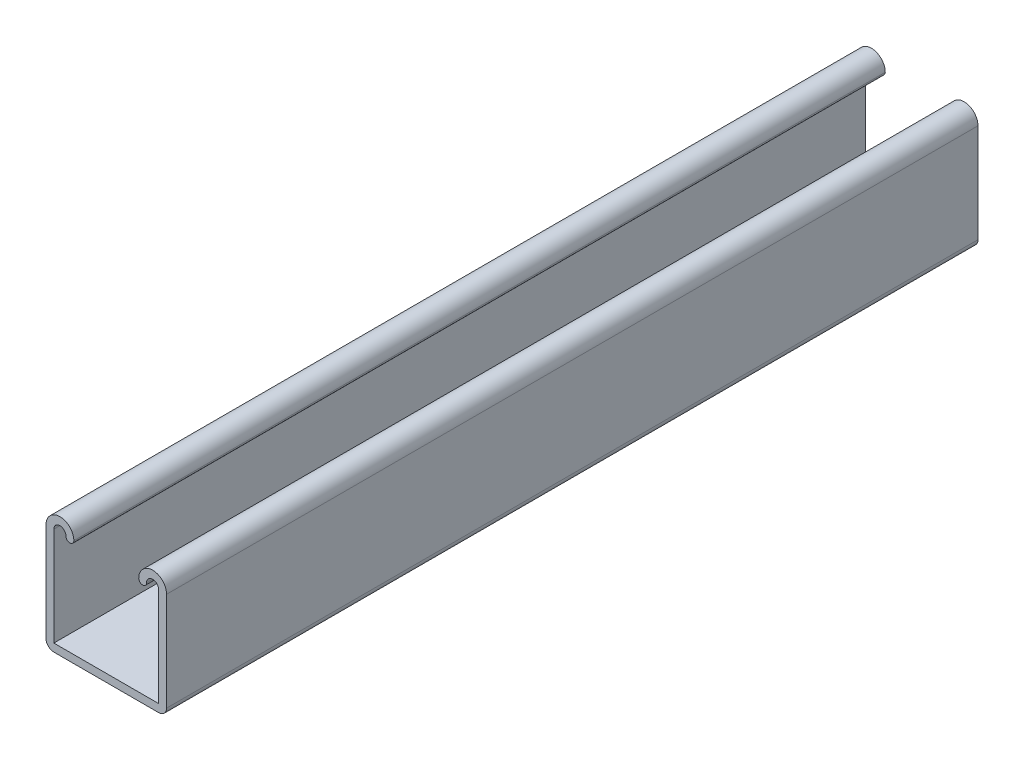
ISO-10303-21;
HEADER;
FILE_DESCRIPTION(('STEP AP214'),'2;1');
FILE_NAME('part.step','',(''),(''),'','','');
FILE_SCHEMA(('AUTOMOTIVE_DESIGN { 1 0 10303 214 1 1 1 1 }'));
ENDSEC;
DATA;
#1=APPLICATION_CONTEXT('core data for automotive mechanical design processes');
#2=APPLICATION_PROTOCOL_DEFINITION('international standard','automotive_design',2000,#1);
#3=PRODUCT_CONTEXT('',#1,'mechanical');
#4=PRODUCT('Part','Part','',(#3));
#5=PRODUCT_RELATED_PRODUCT_CATEGORY('part','',(#4));
#6=PRODUCT_DEFINITION_FORMATION('','',#4);
#7=PRODUCT_DEFINITION_CONTEXT('part definition',#1,'design');
#8=PRODUCT_DEFINITION('design','',#6,#7);
#9=PRODUCT_DEFINITION_SHAPE('','',#8);
#10=(LENGTH_UNIT() NAMED_UNIT(*) SI_UNIT(.MILLI.,.METRE.));
#11=(NAMED_UNIT(*) PLANE_ANGLE_UNIT() SI_UNIT($,.RADIAN.));
#12=(NAMED_UNIT(*) SI_UNIT($,.STERADIAN.) SOLID_ANGLE_UNIT());
#13=UNCERTAINTY_MEASURE_WITH_UNIT(LENGTH_MEASURE(1.E-05),#10,'distance_accuracy_value','');
#14=(GEOMETRIC_REPRESENTATION_CONTEXT(3) GLOBAL_UNCERTAINTY_ASSIGNED_CONTEXT((#13)) GLOBAL_UNIT_ASSIGNED_CONTEXT((#10,
#11,#12)) REPRESENTATION_CONTEXT('',''));
#15=CARTESIAN_POINT('',(0.,0.,0.));
#16=DIRECTION('',(0.,0.,1.));
#17=DIRECTION('',(1.,0.,0.));
#18=AXIS2_PLACEMENT_3D('',#15,#16,#17);
#19=CARTESIAN_POINT('',(0.,2.6924,278.384));
#20=DIRECTION('',(0.,0.,-1.));
#21=DIRECTION('',(-1.,0.,0.));
#22=AXIS2_PLACEMENT_3D('',#19,#20,#21);
#23=CYLINDRICAL_SURFACE('',#22,2.6924);
#24=CARTESIAN_POINT('',(0.,2.6924,0.));
#25=DIRECTION('',(0.,0.,1.));
#26=DIRECTION('',(-1.,0.,0.));
#27=AXIS2_PLACEMENT_3D('',#24,#25,#26);
#28=CIRCLE('',#27,2.6924);
#29=CARTESIAN_POINT('',(-2.6924,2.6924,0.));
#30=VERTEX_POINT('',#29);
#31=CARTESIAN_POINT('',(0.,0.,0.));
#32=VERTEX_POINT('',#31);
#33=EDGE_CURVE('E167',#30,#32,#28,.T.);
#34=ORIENTED_EDGE('',*,*,#33,.T.);
#35=DIRECTION('',(0.,0.,-1.));
#36=VECTOR('',#35,1.);
#37=CARTESIAN_POINT('',(0.,0.,278.384));
#38=LINE('',#37,#36);
#39=CARTESIAN_POINT('',(0.,0.,278.384));
#40=VERTEX_POINT('',#39);
#41=EDGE_CURVE('E225',#40,#32,#38,.T.);
#42=ORIENTED_EDGE('',*,*,#41,.F.);
#43=CARTESIAN_POINT('',(0.,2.6924,278.384));
#44=DIRECTION('',(0.,0.,1.));
#45=DIRECTION('',(-1.,0.,0.));
#46=AXIS2_PLACEMENT_3D('',#43,#44,#45);
#47=CIRCLE('',#46,2.6924);
#48=CARTESIAN_POINT('',(-2.6924,2.6924,278.384));
#49=VERTEX_POINT('',#48);
#50=EDGE_CURVE('E194',#49,#40,#47,.T.);
#51=ORIENTED_EDGE('',*,*,#50,.F.);
#52=DIRECTION('',(0.,0.,-1.));
#53=VECTOR('',#52,1.);
#54=CARTESIAN_POINT('',(-2.6924,2.6924,278.384));
#55=LINE('',#54,#53);
#56=EDGE_CURVE('E163',#49,#30,#55,.T.);
#57=ORIENTED_EDGE('',*,*,#56,.T.);
#58=EDGE_LOOP('',(#34,#42,#51,#57));
#59=FACE_BOUND('',#58,.T.);
#60=ADVANCED_FACE('F33',(#59),#23,.T.);
#61=CARTESIAN_POINT('',(0.,0.,278.384));
#62=DIRECTION('',(0.,1.,0.));
#63=DIRECTION('',(0.,0.,1.));
#64=AXIS2_PLACEMENT_3D('',#61,#62,#63);
#65=PLANE('',#64);
#66=CARTESIAN_POINT('',(17.99,0.,89.916));
#67=DIRECTION('',(0.,-1.,0.));
#68=DIRECTION('',(0.,0.,-1.));
#69=AXIS2_PLACEMENT_3D('',#66,#67,#68);
#70=CIRCLE('',#69,7.112);
#71=CARTESIAN_POINT('',(17.99,0.,82.804));
#72=VERTEX_POINT('',#71);
#73=EDGE_CURVE('E449',#72,#72,#70,.T.);
#74=ORIENTED_EDGE('',*,*,#73,.F.);
#75=EDGE_LOOP('',(#74));
#76=FACE_BOUND('',#75,.T.);
#77=CARTESIAN_POINT('',(17.99,0.,42.164));
#78=DIRECTION('',(0.,-1.,0.));
#79=DIRECTION('',(0.,0.,-1.));
#80=AXIS2_PLACEMENT_3D('',#77,#78,#79);
#81=CIRCLE('',#80,7.112);
#82=CARTESIAN_POINT('',(17.99,0.,35.052));
#83=VERTEX_POINT('',#82);
#84=EDGE_CURVE('E230',#83,#83,#81,.T.);
#85=ORIENTED_EDGE('',*,*,#84,.F.);
#86=EDGE_LOOP('',(#85));
#87=FACE_BOUND('',#86,.T.);
#88=DIRECTION('',(1.,0.,0.));
#89=VECTOR('',#88,1.);
#90=CARTESIAN_POINT('',(0.,0.,0.));
#91=LINE('',#90,#89);
#92=CARTESIAN_POINT('',(35.98,0.,0.));
#93=VERTEX_POINT('',#92);
#94=EDGE_CURVE('E170',#32,#93,#91,.T.);
#95=ORIENTED_EDGE('',*,*,#94,.T.);
#96=DIRECTION('',(0.,0.,-1.));
#97=VECTOR('',#96,1.);
#98=CARTESIAN_POINT('',(35.98,0.,278.384));
#99=LINE('',#98,#97);
#100=CARTESIAN_POINT('',(35.98,0.,278.384));
#101=VERTEX_POINT('',#100);
#102=EDGE_CURVE('E222',#101,#93,#99,.T.);
#103=ORIENTED_EDGE('',*,*,#102,.F.);
#104=DIRECTION('',(1.,0.,0.));
#105=VECTOR('',#104,1.);
#106=CARTESIAN_POINT('',(0.,0.,278.384));
#107=LINE('',#106,#105);
#108=EDGE_CURVE('E112',#40,#101,#107,.T.);
#109=ORIENTED_EDGE('',*,*,#108,.F.);
#110=ORIENTED_EDGE('',*,*,#41,.T.);
#111=EDGE_LOOP('',(#95,#103,#109,#110));
#112=FACE_BOUND('',#111,.T.);
#113=CARTESIAN_POINT('',(17.99,0.,137.668));
#114=DIRECTION('',(0.,-1.,0.));
#115=DIRECTION('',(0.,0.,-1.));
#116=AXIS2_PLACEMENT_3D('',#113,#114,#115);
#117=CIRCLE('',#116,7.112);
#118=CARTESIAN_POINT('',(17.99,0.,130.556));
#119=VERTEX_POINT('',#118);
#120=EDGE_CURVE('E227',#119,#119,#117,.T.);
#121=ORIENTED_EDGE('',*,*,#120,.F.);
#122=EDGE_LOOP('',(#121));
#123=FACE_BOUND('',#122,.T.);
#124=CARTESIAN_POINT('',(17.99,0.,185.42));
#125=DIRECTION('',(0.,-1.,0.));
#126=DIRECTION('',(0.,0.,-1.));
#127=AXIS2_PLACEMENT_3D('',#124,#125,#126);
#128=CIRCLE('',#127,7.112);
#129=CARTESIAN_POINT('',(17.99,0.,178.308));
#130=VERTEX_POINT('',#129);
#131=EDGE_CURVE('E236',#130,#130,#128,.T.);
#132=ORIENTED_EDGE('',*,*,#131,.F.);
#133=EDGE_LOOP('',(#132));
#134=FACE_BOUND('',#133,.T.);
#135=CARTESIAN_POINT('',(17.99,0.,233.172));
#136=DIRECTION('',(0.,-1.,0.));
#137=DIRECTION('',(0.,0.,-1.));
#138=AXIS2_PLACEMENT_3D('',#135,#136,#137);
#139=CIRCLE('',#138,7.112);
#140=CARTESIAN_POINT('',(17.99,0.,226.06));
#141=VERTEX_POINT('',#140);
#142=EDGE_CURVE('E42',#141,#141,#139,.T.);
#143=ORIENTED_EDGE('',*,*,#142,.F.);
#144=EDGE_LOOP('',(#143));
#145=FACE_BOUND('',#144,.T.);
#146=ADVANCED_FACE('F246',(#76,#87,#112,#123,#134,#145),#65,.F.);
#147=CARTESIAN_POINT('',(35.98,2.6924,278.384));
#148=DIRECTION('',(0.,0.,-1.));
#149=DIRECTION('',(-1.,0.,0.));
#150=AXIS2_PLACEMENT_3D('',#147,#148,#149);
#151=CYLINDRICAL_SURFACE('',#150,2.6924);
#152=CARTESIAN_POINT('',(35.98,2.6924,0.));
#153=DIRECTION('',(0.,0.,1.));
#154=DIRECTION('',(1.,0.,0.));
#155=AXIS2_PLACEMENT_3D('',#152,#153,#154);
#156=CIRCLE('',#155,2.6924);
#157=CARTESIAN_POINT('',(38.6724,2.6924,0.));
#158=VERTEX_POINT('',#157);
#159=EDGE_CURVE('E173',#93,#158,#156,.T.);
#160=ORIENTED_EDGE('',*,*,#159,.T.);
#161=DIRECTION('',(0.,0.,-1.));
#162=VECTOR('',#161,1.);
#163=CARTESIAN_POINT('',(38.6724,2.6924,278.384));
#164=LINE('',#163,#162);
#165=CARTESIAN_POINT('',(38.6724,2.6924,278.384));
#166=VERTEX_POINT('',#165);
#167=EDGE_CURVE('E219',#166,#158,#164,.T.);
#168=ORIENTED_EDGE('',*,*,#167,.F.);
#169=CARTESIAN_POINT('',(35.98,2.6924,278.384));
#170=DIRECTION('',(0.,0.,1.));
#171=DIRECTION('',(1.,0.,0.));
#172=AXIS2_PLACEMENT_3D('',#169,#170,#171);
#173=CIRCLE('',#172,2.6924);
#174=EDGE_CURVE('E459',#101,#166,#173,.T.);
#175=ORIENTED_EDGE('',*,*,#174,.F.);
#176=ORIENTED_EDGE('',*,*,#102,.T.);
#177=EDGE_LOOP('',(#160,#168,#175,#176));
#178=FACE_BOUND('',#177,.T.);
#179=ADVANCED_FACE('F248',(#178),#151,.T.);
#180=CARTESIAN_POINT('',(38.6724,2.6924,278.384));
#181=DIRECTION('',(-1.,0.,0.));
#182=DIRECTION('',(0.,0.,1.));
#183=AXIS2_PLACEMENT_3D('',#180,#181,#182);
#184=PLANE('',#183);
#185=DIRECTION('',(0.,1.,0.));
#186=VECTOR('',#185,1.);
#187=CARTESIAN_POINT('',(38.6724,2.6924,0.));
#188=LINE('',#187,#186);
#189=CARTESIAN_POINT('',(38.6724,36.5252,0.));
#190=VERTEX_POINT('',#189);
#191=EDGE_CURVE('E175',#158,#190,#188,.T.);
#192=ORIENTED_EDGE('',*,*,#191,.T.);
#193=DIRECTION('',(0.,0.,-1.));
#194=VECTOR('',#193,1.);
#195=CARTESIAN_POINT('',(38.6724,36.5252,278.384));
#196=LINE('',#195,#194);
#197=CARTESIAN_POINT('',(38.6724,36.5252,278.384));
#198=VERTEX_POINT('',#197);
#199=EDGE_CURVE('E216',#198,#190,#196,.T.);
#200=ORIENTED_EDGE('',*,*,#199,.F.);
#201=DIRECTION('',(0.,1.,0.));
#202=VECTOR('',#201,1.);
#203=CARTESIAN_POINT('',(38.6724,2.6924,278.384));
#204=LINE('',#203,#202);
#205=EDGE_CURVE('E461',#166,#198,#204,.T.);
#206=ORIENTED_EDGE('',*,*,#205,.F.);
#207=ORIENTED_EDGE('',*,*,#167,.T.);
#208=EDGE_LOOP('',(#192,#200,#206,#207));
#209=FACE_BOUND('',#208,.T.);
#210=ADVANCED_FACE('F255',(#209),#184,.F.);
#211=CARTESIAN_POINT('',(33.8972,36.5252,278.384));
#212=DIRECTION('',(0.,0.,-1.));
#213=DIRECTION('',(-1.,0.,0.));
#214=AXIS2_PLACEMENT_3D('',#211,#212,#213);
#215=CYLINDRICAL_SURFACE('',#214,4.7752);
#216=CARTESIAN_POINT('',(33.8972,36.5252,0.));
#217=DIRECTION('',(0.,0.,1.));
#218=DIRECTION('',(1.,0.,0.));
#219=AXIS2_PLACEMENT_3D('',#216,#217,#218);
#220=CIRCLE('',#219,4.7752);
#221=CARTESIAN_POINT('',(29.122,36.5252,0.));
#222=VERTEX_POINT('',#221);
#223=EDGE_CURVE('E177',#190,#222,#220,.T.);
#224=ORIENTED_EDGE('',*,*,#223,.T.);
#225=DIRECTION('',(0.,0.,-1.));
#226=VECTOR('',#225,1.);
#227=CARTESIAN_POINT('',(29.122,36.5252,278.384));
#228=LINE('',#227,#226);
#229=CARTESIAN_POINT('',(29.122,36.5252,278.384));
#230=VERTEX_POINT('',#229);
#231=EDGE_CURVE('E213',#230,#222,#228,.T.);
#232=ORIENTED_EDGE('',*,*,#231,.F.);
#233=CARTESIAN_POINT('',(33.8972,36.5252,278.384));
#234=DIRECTION('',(0.,0.,1.));
#235=DIRECTION('',(1.,0.,0.));
#236=AXIS2_PLACEMENT_3D('',#233,#234,#235);
#237=CIRCLE('',#236,4.7752);
#238=EDGE_CURVE('E323',#198,#230,#237,.T.);
#239=ORIENTED_EDGE('',*,*,#238,.F.);
#240=ORIENTED_EDGE('',*,*,#199,.T.);
#241=EDGE_LOOP('',(#224,#232,#239,#240));
#242=FACE_BOUND('',#241,.T.);
#243=ADVANCED_FACE('F306',(#242),#215,.T.);
#244=CARTESIAN_POINT('',(30.4682,36.5252,278.384));
#245=DIRECTION('',(0.,0.,-1.));
#246=DIRECTION('',(-1.,0.,0.));
#247=AXIS2_PLACEMENT_3D('',#244,#245,#246);
#248=CYLINDRICAL_SURFACE('',#247,1.3462);
#249=CARTESIAN_POINT('',(30.4682,36.5252,0.));
#250=DIRECTION('',(0.,0.,1.));
#251=DIRECTION('',(1.,0.,0.));
#252=AXIS2_PLACEMENT_3D('',#249,#250,#251);
#253=CIRCLE('',#252,1.3462);
#254=CARTESIAN_POINT('',(31.8144,36.5252,0.));
#255=VERTEX_POINT('',#254);
#256=EDGE_CURVE('E179',#222,#255,#253,.T.);
#257=ORIENTED_EDGE('',*,*,#256,.T.);
#258=DIRECTION('',(0.,0.,-1.));
#259=VECTOR('',#258,1.);
#260=CARTESIAN_POINT('',(31.8144,36.5252,278.384));
#261=LINE('',#260,#259);
#262=CARTESIAN_POINT('',(31.8144,36.5252,278.384));
#263=VERTEX_POINT('',#262);
#264=EDGE_CURVE('E210',#263,#255,#261,.T.);
#265=ORIENTED_EDGE('',*,*,#264,.F.);
#266=CARTESIAN_POINT('',(30.4682,36.5252,278.384));
#267=DIRECTION('',(0.,0.,1.));
#268=DIRECTION('',(1.,0.,0.));
#269=AXIS2_PLACEMENT_3D('',#266,#267,#268);
#270=CIRCLE('',#269,1.3462);
#271=EDGE_CURVE('E336',#230,#263,#270,.T.);
#272=ORIENTED_EDGE('',*,*,#271,.F.);
#273=ORIENTED_EDGE('',*,*,#231,.T.);
#274=EDGE_LOOP('',(#257,#265,#272,#273));
#275=FACE_BOUND('',#274,.T.);
#276=ADVANCED_FACE('F302',(#275),#248,.T.);
#277=CARTESIAN_POINT('',(33.8972,36.5252,278.384));
#278=DIRECTION('',(0.,0.,-1.));
#279=DIRECTION('',(-1.,0.,0.));
#280=AXIS2_PLACEMENT_3D('',#277,#278,#279);
#281=CYLINDRICAL_SURFACE('',#280,2.0828);
#282=CARTESIAN_POINT('',(33.8972,36.5252,0.));
#283=DIRECTION('',(0.,0.,-1.));
#284=DIRECTION('',(1.,0.,0.));
#285=AXIS2_PLACEMENT_3D('',#282,#283,#284);
#286=CIRCLE('',#285,2.0828);
#287=CARTESIAN_POINT('',(35.98,36.5252,0.));
#288=VERTEX_POINT('',#287);
#289=EDGE_CURVE('E181',#255,#288,#286,.T.);
#290=ORIENTED_EDGE('',*,*,#289,.T.);
#291=DIRECTION('',(0.,0.,-1.));
#292=VECTOR('',#291,1.);
#293=CARTESIAN_POINT('',(35.98,36.5252,278.384));
#294=LINE('',#293,#292);
#295=CARTESIAN_POINT('',(35.98,36.5252,278.384));
#296=VERTEX_POINT('',#295);
#297=EDGE_CURVE('E207',#296,#288,#294,.T.);
#298=ORIENTED_EDGE('',*,*,#297,.F.);
#299=CARTESIAN_POINT('',(33.8972,36.5252,278.384));
#300=DIRECTION('',(0.,0.,-1.));
#301=DIRECTION('',(1.,0.,0.));
#302=AXIS2_PLACEMENT_3D('',#299,#300,#301);
#303=CIRCLE('',#302,2.0828);
#304=EDGE_CURVE('E333',#263,#296,#303,.T.);
#305=ORIENTED_EDGE('',*,*,#304,.F.);
#306=ORIENTED_EDGE('',*,*,#264,.T.);
#307=EDGE_LOOP('',(#290,#298,#305,#306));
#308=FACE_BOUND('',#307,.T.);
#309=ADVANCED_FACE('F293',(#308),#281,.F.);
#310=CARTESIAN_POINT('',(35.98,2.6924,278.384));
#311=DIRECTION('',(1.,0.,0.));
#312=DIRECTION('',(0.,0.,-1.));
#313=AXIS2_PLACEMENT_3D('',#310,#311,#312);
#314=PLANE('',#313);
#315=DIRECTION('',(0.,-1.,0.));
#316=VECTOR('',#315,1.);
#317=CARTESIAN_POINT('',(35.98,2.6924,0.));
#318=LINE('',#317,#316);
#319=CARTESIAN_POINT('',(35.98,2.6924,0.));
#320=VERTEX_POINT('',#319);
#321=EDGE_CURVE('E183',#288,#320,#318,.T.);
#322=ORIENTED_EDGE('',*,*,#321,.T.);
#323=DIRECTION('',(0.,0.,-1.));
#324=VECTOR('',#323,1.);
#325=CARTESIAN_POINT('',(35.98,2.6924,278.384));
#326=LINE('',#325,#324);
#327=CARTESIAN_POINT('',(35.98,2.6924,278.384));
#328=VERTEX_POINT('',#327);
#329=EDGE_CURVE('E204',#328,#320,#326,.T.);
#330=ORIENTED_EDGE('',*,*,#329,.F.);
#331=DIRECTION('',(0.,-1.,0.));
#332=VECTOR('',#331,1.);
#333=CARTESIAN_POINT('',(35.98,2.6924,278.384));
#334=LINE('',#333,#332);
#335=EDGE_CURVE('E335',#296,#328,#334,.T.);
#336=ORIENTED_EDGE('',*,*,#335,.F.);
#337=ORIENTED_EDGE('',*,*,#297,.T.);
#338=EDGE_LOOP('',(#322,#330,#336,#337));
#339=FACE_BOUND('',#338,.T.);
#340=ADVANCED_FACE('F282',(#339),#314,.F.);
#341=CARTESIAN_POINT('',(35.98,2.6924,278.384));
#342=DIRECTION('',(0.,-1.,0.));
#343=DIRECTION('',(0.,0.,-1.));
#344=AXIS2_PLACEMENT_3D('',#341,#342,#343);
#345=PLANE('',#344);
#346=CARTESIAN_POINT('',(17.99,2.6924,89.916));
#347=DIRECTION('',(0.,-1.,0.));
#348=DIRECTION('',(0.,0.,-1.));
#349=AXIS2_PLACEMENT_3D('',#346,#347,#348);
#350=CIRCLE('',#349,7.112);
#351=CARTESIAN_POINT('',(17.99,2.6924,82.804));
#352=VERTEX_POINT('',#351);
#353=EDGE_CURVE('E451',#352,#352,#350,.T.);
#354=ORIENTED_EDGE('',*,*,#353,.T.);
#355=EDGE_LOOP('',(#354));
#356=FACE_BOUND('',#355,.T.);
#357=CARTESIAN_POINT('',(17.99,2.6924,42.164));
#358=DIRECTION('',(0.,-1.,0.));
#359=DIRECTION('',(0.,0.,-1.));
#360=AXIS2_PLACEMENT_3D('',#357,#358,#359);
#361=CIRCLE('',#360,7.112);
#362=CARTESIAN_POINT('',(17.99,2.6924,35.052));
#363=VERTEX_POINT('',#362);
#364=EDGE_CURVE('E171',#363,#363,#361,.T.);
#365=ORIENTED_EDGE('',*,*,#364,.T.);
#366=EDGE_LOOP('',(#365));
#367=FACE_BOUND('',#366,.T.);
#368=DIRECTION('',(-1.,0.,0.));
#369=VECTOR('',#368,1.);
#370=CARTESIAN_POINT('',(35.98,2.6924,0.));
#371=LINE('',#370,#369);
#372=CARTESIAN_POINT('',(0.,2.6924,0.));
#373=VERTEX_POINT('',#372);
#374=EDGE_CURVE('E185',#320,#373,#371,.T.);
#375=ORIENTED_EDGE('',*,*,#374,.T.);
#376=DIRECTION('',(0.,0.,-1.));
#377=VECTOR('',#376,1.);
#378=CARTESIAN_POINT('',(0.,2.6924,278.384));
#379=LINE('',#378,#377);
#380=CARTESIAN_POINT('',(0.,2.6924,278.384));
#381=VERTEX_POINT('',#380);
#382=EDGE_CURVE('E201',#381,#373,#379,.T.);
#383=ORIENTED_EDGE('',*,*,#382,.F.);
#384=DIRECTION('',(-1.,0.,0.));
#385=VECTOR('',#384,1.);
#386=CARTESIAN_POINT('',(35.98,2.6924,278.384));
#387=LINE('',#386,#385);
#388=EDGE_CURVE('E338',#328,#381,#387,.T.);
#389=ORIENTED_EDGE('',*,*,#388,.F.);
#390=ORIENTED_EDGE('',*,*,#329,.T.);
#391=EDGE_LOOP('',(#375,#383,#389,#390));
#392=FACE_BOUND('',#391,.T.);
#393=CARTESIAN_POINT('',(17.99,2.6924,137.668));
#394=DIRECTION('',(0.,-1.,0.));
#395=DIRECTION('',(0.,0.,-1.));
#396=AXIS2_PLACEMENT_3D('',#393,#394,#395);
#397=CIRCLE('',#396,7.112);
#398=CARTESIAN_POINT('',(17.99,2.6924,130.556));
#399=VERTEX_POINT('',#398);
#400=EDGE_CURVE('E233',#399,#399,#397,.T.);
#401=ORIENTED_EDGE('',*,*,#400,.T.);
#402=EDGE_LOOP('',(#401));
#403=FACE_BOUND('',#402,.T.);
#404=CARTESIAN_POINT('',(17.99,2.6924,185.42));
#405=DIRECTION('',(0.,-1.,0.));
#406=DIRECTION('',(0.,0.,-1.));
#407=AXIS2_PLACEMENT_3D('',#404,#405,#406);
#408=CIRCLE('',#407,7.112);
#409=CARTESIAN_POINT('',(17.99,2.6924,178.308));
#410=VERTEX_POINT('',#409);
#411=EDGE_CURVE('E239',#410,#410,#408,.T.);
#412=ORIENTED_EDGE('',*,*,#411,.T.);
#413=EDGE_LOOP('',(#412));
#414=FACE_BOUND('',#413,.T.);
#415=CARTESIAN_POINT('',(17.99,2.6924,233.172));
#416=DIRECTION('',(0.,-1.,0.));
#417=DIRECTION('',(0.,0.,-1.));
#418=AXIS2_PLACEMENT_3D('',#415,#416,#417);
#419=CIRCLE('',#418,7.112);
#420=CARTESIAN_POINT('',(17.99,2.6924,226.06));
#421=VERTEX_POINT('',#420);
#422=EDGE_CURVE('E11',#421,#421,#419,.T.);
#423=ORIENTED_EDGE('',*,*,#422,.T.);
#424=EDGE_LOOP('',(#423));
#425=FACE_BOUND('',#424,.T.);
#426=ADVANCED_FACE('F278',(#356,#367,#392,#403,#414,#425),#345,.F.);
#427=CARTESIAN_POINT('',(0.,2.6924,278.384));
#428=DIRECTION('',(-1.,0.,0.));
#429=DIRECTION('',(0.,0.,1.));
#430=AXIS2_PLACEMENT_3D('',#427,#428,#429);
#431=PLANE('',#430);
#432=DIRECTION('',(0.,1.,0.));
#433=VECTOR('',#432,1.);
#434=CARTESIAN_POINT('',(0.,2.6924,0.));
#435=LINE('',#434,#433);
#436=CARTESIAN_POINT('',(0.,36.5252,0.));
#437=VERTEX_POINT('',#436);
#438=EDGE_CURVE('E187',#373,#437,#435,.T.);
#439=ORIENTED_EDGE('',*,*,#438,.T.);
#440=DIRECTION('',(0.,0.,-1.));
#441=VECTOR('',#440,1.);
#442=CARTESIAN_POINT('',(0.,36.5252,278.384));
#443=LINE('',#442,#441);
#444=CARTESIAN_POINT('',(0.,36.5252,278.384));
#445=VERTEX_POINT('',#444);
#446=EDGE_CURVE('E198',#445,#437,#443,.T.);
#447=ORIENTED_EDGE('',*,*,#446,.F.);
#448=DIRECTION('',(0.,1.,0.));
#449=VECTOR('',#448,1.);
#450=CARTESIAN_POINT('',(0.,2.6924,278.384));
#451=LINE('',#450,#449);
#452=EDGE_CURVE('E344',#381,#445,#451,.T.);
#453=ORIENTED_EDGE('',*,*,#452,.F.);
#454=ORIENTED_EDGE('',*,*,#382,.T.);
#455=EDGE_LOOP('',(#439,#447,#453,#454));
#456=FACE_BOUND('',#455,.T.);
#457=ADVANCED_FACE('F281',(#456),#431,.F.);
#458=CARTESIAN_POINT('',(2.0828,36.5252,278.384));
#459=DIRECTION('',(0.,0.,-1.));
#460=DIRECTION('',(-1.,0.,0.));
#461=AXIS2_PLACEMENT_3D('',#458,#459,#460);
#462=CYLINDRICAL_SURFACE('',#461,2.0828);
#463=CARTESIAN_POINT('',(2.0828,36.5252,0.));
#464=DIRECTION('',(0.,0.,-1.));
#465=DIRECTION('',(-1.,0.,0.));
#466=AXIS2_PLACEMENT_3D('',#463,#464,#465);
#467=CIRCLE('',#466,2.0828);
#468=CARTESIAN_POINT('',(4.16560000000001,36.5252,0.));
#469=VERTEX_POINT('',#468);
#470=EDGE_CURVE('E189',#437,#469,#467,.T.);
#471=ORIENTED_EDGE('',*,*,#470,.T.);
#472=DIRECTION('',(0.,0.,-1.));
#473=VECTOR('',#472,1.);
#474=CARTESIAN_POINT('',(4.16560000000001,36.5252,278.384));
#475=LINE('',#474,#473);
#476=CARTESIAN_POINT('',(4.16560000000001,36.5252,278.384));
#477=VERTEX_POINT('',#476);
#478=EDGE_CURVE('E158',#477,#469,#475,.T.);
#479=ORIENTED_EDGE('',*,*,#478,.F.);
#480=CARTESIAN_POINT('',(2.0828,36.5252,278.384));
#481=DIRECTION('',(0.,0.,-1.));
#482=DIRECTION('',(-1.,0.,0.));
#483=AXIS2_PLACEMENT_3D('',#480,#481,#482);
#484=CIRCLE('',#483,2.0828);
#485=EDGE_CURVE('E149',#445,#477,#484,.T.);
#486=ORIENTED_EDGE('',*,*,#485,.F.);
#487=ORIENTED_EDGE('',*,*,#446,.T.);
#488=EDGE_LOOP('',(#471,#479,#486,#487));
#489=FACE_BOUND('',#488,.T.);
#490=ADVANCED_FACE('F290',(#489),#462,.F.);
#491=CARTESIAN_POINT('',(5.5118,36.5252,278.384));
#492=DIRECTION('',(0.,0.,-1.));
#493=DIRECTION('',(-1.,0.,0.));
#494=AXIS2_PLACEMENT_3D('',#491,#492,#493);
#495=CYLINDRICAL_SURFACE('',#494,1.3462);
#496=CARTESIAN_POINT('',(5.5118,36.5252,0.));
#497=DIRECTION('',(0.,0.,1.));
#498=DIRECTION('',(-1.,0.,0.));
#499=AXIS2_PLACEMENT_3D('',#496,#497,#498);
#500=CIRCLE('',#499,1.3462);
#501=CARTESIAN_POINT('',(6.858,36.5252,0.));
#502=VERTEX_POINT('',#501);
#503=EDGE_CURVE('E157',#469,#502,#500,.T.);
#504=ORIENTED_EDGE('',*,*,#503,.T.);
#505=DIRECTION('',(0.,0.,-1.));
#506=VECTOR('',#505,1.);
#507=CARTESIAN_POINT('',(6.858,36.5252,278.384));
#508=LINE('',#507,#506);
#509=CARTESIAN_POINT('',(6.858,36.5252,278.384));
#510=VERTEX_POINT('',#509);
#511=EDGE_CURVE('E154',#510,#502,#508,.T.);
#512=ORIENTED_EDGE('',*,*,#511,.F.);
#513=CARTESIAN_POINT('',(5.5118,36.5252,278.384));
#514=DIRECTION('',(0.,0.,1.));
#515=DIRECTION('',(-1.,0.,0.));
#516=AXIS2_PLACEMENT_3D('',#513,#514,#515);
#517=CIRCLE('',#516,1.3462);
#518=EDGE_CURVE('E143',#477,#510,#517,.T.);
#519=ORIENTED_EDGE('',*,*,#518,.F.);
#520=ORIENTED_EDGE('',*,*,#478,.T.);
#521=EDGE_LOOP('',(#504,#512,#519,#520));
#522=FACE_BOUND('',#521,.T.);
#523=ADVANCED_FACE('F155',(#522),#495,.T.);
#524=CARTESIAN_POINT('',(2.0828,36.5252,278.384));
#525=DIRECTION('',(0.,0.,-1.));
#526=DIRECTION('',(-1.,0.,0.));
#527=AXIS2_PLACEMENT_3D('',#524,#525,#526);
#528=CYLINDRICAL_SURFACE('',#527,4.7752);
#529=CARTESIAN_POINT('',(2.0828,36.5252,0.));
#530=DIRECTION('',(0.,0.,1.));
#531=DIRECTION('',(-1.,0.,0.));
#532=AXIS2_PLACEMENT_3D('',#529,#530,#531);
#533=CIRCLE('',#532,4.7752);
#534=CARTESIAN_POINT('',(-2.6924,36.5252,0.));
#535=VERTEX_POINT('',#534);
#536=EDGE_CURVE('E97',#502,#535,#533,.T.);
#537=ORIENTED_EDGE('',*,*,#536,.T.);
#538=DIRECTION('',(0.,0.,-1.));
#539=VECTOR('',#538,1.);
#540=CARTESIAN_POINT('',(-2.6924,36.5252,278.384));
#541=LINE('',#540,#539);
#542=CARTESIAN_POINT('',(-2.6924,36.5252,278.384));
#543=VERTEX_POINT('',#542);
#544=EDGE_CURVE('E159',#543,#535,#541,.T.);
#545=ORIENTED_EDGE('',*,*,#544,.F.);
#546=CARTESIAN_POINT('',(2.0828,36.5252,278.384));
#547=DIRECTION('',(0.,0.,1.));
#548=DIRECTION('',(-1.,0.,0.));
#549=AXIS2_PLACEMENT_3D('',#546,#547,#548);
#550=CIRCLE('',#549,4.7752);
#551=EDGE_CURVE('E147',#510,#543,#550,.T.);
#552=ORIENTED_EDGE('',*,*,#551,.F.);
#553=ORIENTED_EDGE('',*,*,#511,.T.);
#554=EDGE_LOOP('',(#537,#545,#552,#553));
#555=FACE_BOUND('',#554,.T.);
#556=ADVANCED_FACE('F161',(#555),#528,.T.);
#557=CARTESIAN_POINT('',(-2.6924,2.6924,278.384));
#558=DIRECTION('',(1.,0.,0.));
#559=DIRECTION('',(0.,0.,-1.));
#560=AXIS2_PLACEMENT_3D('',#557,#558,#559);
#561=PLANE('',#560);
#562=DIRECTION('',(0.,-1.,0.));
#563=VECTOR('',#562,1.);
#564=CARTESIAN_POINT('',(-2.6924,2.6924,0.));
#565=LINE('',#564,#563);
#566=EDGE_CURVE('E103',#535,#30,#565,.T.);
#567=ORIENTED_EDGE('',*,*,#566,.T.);
#568=ORIENTED_EDGE('',*,*,#56,.F.);
#569=DIRECTION('',(0.,-1.,0.));
#570=VECTOR('',#569,1.);
#571=CARTESIAN_POINT('',(-2.6924,2.6924,278.384));
#572=LINE('',#571,#570);
#573=EDGE_CURVE('E50',#543,#49,#572,.T.);
#574=ORIENTED_EDGE('',*,*,#573,.F.);
#575=ORIENTED_EDGE('',*,*,#544,.T.);
#576=EDGE_LOOP('',(#567,#568,#574,#575));
#577=FACE_BOUND('',#576,.T.);
#578=ADVANCED_FACE('F354',(#577),#561,.F.);
#579=CARTESIAN_POINT('',(0.,2.6924,278.384));
#580=DIRECTION('',(0.,0.,-1.));
#581=DIRECTION('',(-1.,0.,0.));
#582=AXIS2_PLACEMENT_3D('',#579,#580,#581);
#583=PLANE('',#582);
#584=ORIENTED_EDGE('',*,*,#50,.T.);
#585=ORIENTED_EDGE('',*,*,#108,.T.);
#586=ORIENTED_EDGE('',*,*,#174,.T.);
#587=ORIENTED_EDGE('',*,*,#205,.T.);
#588=ORIENTED_EDGE('',*,*,#238,.T.);
#589=ORIENTED_EDGE('',*,*,#271,.T.);
#590=ORIENTED_EDGE('',*,*,#304,.T.);
#591=ORIENTED_EDGE('',*,*,#335,.T.);
#592=ORIENTED_EDGE('',*,*,#388,.T.);
#593=ORIENTED_EDGE('',*,*,#452,.T.);
#594=ORIENTED_EDGE('',*,*,#485,.T.);
#595=ORIENTED_EDGE('',*,*,#518,.T.);
#596=ORIENTED_EDGE('',*,*,#551,.T.);
#597=ORIENTED_EDGE('',*,*,#573,.T.);
#598=EDGE_LOOP('',(#584,#585,#586,#587,#588,#589,#590,#591,#592,#593,#594,#595,#596,#597));
#599=FACE_BOUND('',#598,.T.);
#600=ADVANCED_FACE('F145',(#599),#583,.F.);
#601=CARTESIAN_POINT('',(0.,2.6924,0.));
#602=DIRECTION('',(0.,0.,-1.));
#603=DIRECTION('',(-1.,0.,0.));
#604=AXIS2_PLACEMENT_3D('',#601,#602,#603);
#605=PLANE('',#604);
#606=ORIENTED_EDGE('',*,*,#33,.F.);
#607=ORIENTED_EDGE('',*,*,#566,.F.);
#608=ORIENTED_EDGE('',*,*,#536,.F.);
#609=ORIENTED_EDGE('',*,*,#503,.F.);
#610=ORIENTED_EDGE('',*,*,#470,.F.);
#611=ORIENTED_EDGE('',*,*,#438,.F.);
#612=ORIENTED_EDGE('',*,*,#374,.F.);
#613=ORIENTED_EDGE('',*,*,#321,.F.);
#614=ORIENTED_EDGE('',*,*,#289,.F.);
#615=ORIENTED_EDGE('',*,*,#256,.F.);
#616=ORIENTED_EDGE('',*,*,#223,.F.);
#617=ORIENTED_EDGE('',*,*,#191,.F.);
#618=ORIENTED_EDGE('',*,*,#159,.F.);
#619=ORIENTED_EDGE('',*,*,#94,.F.);
#620=EDGE_LOOP('',(#606,#607,#608,#609,#610,#611,#612,#613,#614,#615,#616,#617,#618,#619));
#621=FACE_BOUND('',#620,.T.);
#622=ADVANCED_FACE('F326',(#621),#605,.T.);
#623=CARTESIAN_POINT('',(17.99,41.3004,42.164));
#624=DIRECTION('',(0.,-1.,0.));
#625=DIRECTION('',(0.,0.,-1.));
#626=AXIS2_PLACEMENT_3D('',#623,#624,#625);
#627=CYLINDRICAL_SURFACE('',#626,7.112);
#628=ORIENTED_EDGE('',*,*,#84,.T.);
#629=EDGE_LOOP('',(#628));
#630=FACE_BOUND('',#629,.T.);
#631=ORIENTED_EDGE('',*,*,#364,.F.);
#632=EDGE_LOOP('',(#631));
#633=FACE_BOUND('',#632,.T.);
#634=ADVANCED_FACE('F398',(#630,#633),#627,.F.);
#635=CARTESIAN_POINT('',(17.99,41.3004,89.916));
#636=DIRECTION('',(0.,-1.,0.));
#637=DIRECTION('',(0.,0.,-1.));
#638=AXIS2_PLACEMENT_3D('',#635,#636,#637);
#639=CYLINDRICAL_SURFACE('',#638,7.112);
#640=ORIENTED_EDGE('',*,*,#73,.T.);
#641=EDGE_LOOP('',(#640));
#642=FACE_BOUND('',#641,.T.);
#643=ORIENTED_EDGE('',*,*,#353,.F.);
#644=EDGE_LOOP('',(#643));
#645=FACE_BOUND('',#644,.T.);
#646=ADVANCED_FACE('F267',(#642,#645),#639,.F.);
#647=CARTESIAN_POINT('',(17.99,41.3004,137.668));
#648=DIRECTION('',(0.,-1.,0.));
#649=DIRECTION('',(0.,0.,-1.));
#650=AXIS2_PLACEMENT_3D('',#647,#648,#649);
#651=CYLINDRICAL_SURFACE('',#650,7.112);
#652=ORIENTED_EDGE('',*,*,#120,.T.);
#653=EDGE_LOOP('',(#652));
#654=FACE_BOUND('',#653,.T.);
#655=ORIENTED_EDGE('',*,*,#400,.F.);
#656=EDGE_LOOP('',(#655));
#657=FACE_BOUND('',#656,.T.);
#658=ADVANCED_FACE('F264',(#654,#657),#651,.F.);
#659=CARTESIAN_POINT('',(17.99,41.3004,185.42));
#660=DIRECTION('',(0.,-1.,0.));
#661=DIRECTION('',(0.,0.,-1.));
#662=AXIS2_PLACEMENT_3D('',#659,#660,#661);
#663=CYLINDRICAL_SURFACE('',#662,7.112);
#664=ORIENTED_EDGE('',*,*,#131,.T.);
#665=EDGE_LOOP('',(#664));
#666=FACE_BOUND('',#665,.T.);
#667=ORIENTED_EDGE('',*,*,#411,.F.);
#668=EDGE_LOOP('',(#667));
#669=FACE_BOUND('',#668,.T.);
#670=ADVANCED_FACE('F266',(#666,#669),#663,.F.);
#671=CARTESIAN_POINT('',(17.99,41.3004,233.172));
#672=DIRECTION('',(0.,-1.,0.));
#673=DIRECTION('',(0.,0.,-1.));
#674=AXIS2_PLACEMENT_3D('',#671,#672,#673);
#675=CYLINDRICAL_SURFACE('',#674,7.112);
#676=ORIENTED_EDGE('',*,*,#142,.T.);
#677=EDGE_LOOP('',(#676));
#678=FACE_BOUND('',#677,.T.);
#679=ORIENTED_EDGE('',*,*,#422,.F.);
#680=EDGE_LOOP('',(#679));
#681=FACE_BOUND('',#680,.T.);
#682=ADVANCED_FACE('F35',(#678,#681),#675,.F.);
#683=CLOSED_SHELL('',(#60,#146,#179,#210,#243,#276,#309,#340,#426,#457,#490,#523,#556,#578,#600,
#622,#634,#646,#658,#670,#682));
#684=MANIFOLD_SOLID_BREP('B2',#683);
#685=ADVANCED_BREP_SHAPE_REPRESENTATION('',(#18,#684),#14);
#686=SHAPE_DEFINITION_REPRESENTATION(#9,#685);
ENDSEC;
END-ISO-10303-21;
